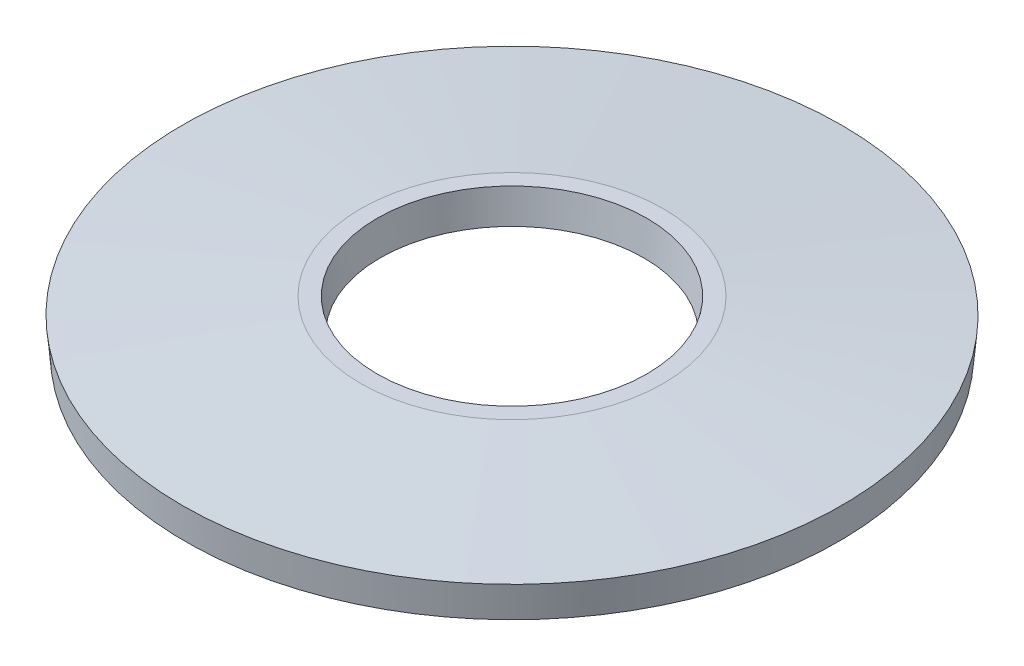
ISO-10303-21;
HEADER;
FILE_DESCRIPTION(('STEP AP214'),'2;1');
FILE_NAME('part.step','',(''),(''),'','','');
FILE_SCHEMA(('AUTOMOTIVE_DESIGN { 1 0 10303 214 1 1 1 1 }'));
ENDSEC;
DATA;
#1=APPLICATION_CONTEXT('core data for automotive mechanical design processes');
#2=APPLICATION_PROTOCOL_DEFINITION('international standard','automotive_design',2000,#1);
#3=PRODUCT_CONTEXT('',#1,'mechanical');
#4=PRODUCT('Part','Part','',(#3));
#5=PRODUCT_RELATED_PRODUCT_CATEGORY('part','',(#4));
#6=PRODUCT_DEFINITION_FORMATION('','',#4);
#7=PRODUCT_DEFINITION_CONTEXT('part definition',#1,'design');
#8=PRODUCT_DEFINITION('design','',#6,#7);
#9=PRODUCT_DEFINITION_SHAPE('','',#8);
#10=(LENGTH_UNIT() NAMED_UNIT(*) SI_UNIT(.MILLI.,.METRE.));
#11=(NAMED_UNIT(*) PLANE_ANGLE_UNIT() SI_UNIT($,.RADIAN.));
#12=(NAMED_UNIT(*) SI_UNIT($,.STERADIAN.) SOLID_ANGLE_UNIT());
#13=UNCERTAINTY_MEASURE_WITH_UNIT(LENGTH_MEASURE(1.E-05),#10,'distance_accuracy_value','');
#14=(GEOMETRIC_REPRESENTATION_CONTEXT(3) GLOBAL_UNCERTAINTY_ASSIGNED_CONTEXT((#13)) GLOBAL_UNIT_ASSIGNED_CONTEXT((#10,
#11,#12)) REPRESENTATION_CONTEXT('',''));
#15=CARTESIAN_POINT('',(0.,0.,0.));
#16=DIRECTION('',(0.,0.,1.));
#17=DIRECTION('',(1.,0.,0.));
#18=AXIS2_PLACEMENT_3D('',#15,#16,#17);
#19=CARTESIAN_POINT('',(-3.96285336374981,0.,0.));
#20=DIRECTION('',(0.,1.,0.));
#21=DIRECTION('',(0.,0.,1.));
#22=AXIS2_PLACEMENT_3D('',#19,#20,#21);
#23=PLANE('',#22);
#24=CARTESIAN_POINT('',(0.,0.,0.));
#25=DIRECTION('',(0.,-1.,0.));
#26=DIRECTION('',(0.,0.,-1.));
#27=AXIS2_PLACEMENT_3D('',#24,#25,#26);
#28=CIRCLE('',#27,3.76285336374981);
#29=CARTESIAN_POINT('',(0.,0.,-3.76285336374981));
#30=VERTEX_POINT('',#29);
#31=EDGE_CURVE('E10',#30,#30,#28,.T.);
#32=ORIENTED_EDGE('',*,*,#31,.F.);
#33=EDGE_LOOP('',(#32));
#34=FACE_BOUND('',#33,.T.);
#35=CARTESIAN_POINT('',(0.,0.,0.));
#36=DIRECTION('',(0.,-1.,0.));
#37=DIRECTION('',(0.,0.,-1.));
#38=AXIS2_PLACEMENT_3D('',#35,#36,#37);
#39=CIRCLE('',#38,3.96285336374981);
#40=CARTESIAN_POINT('',(0.,0.,-3.96285336374981));
#41=VERTEX_POINT('',#40);
#42=EDGE_CURVE('E71',#41,#41,#39,.T.);
#43=ORIENTED_EDGE('',*,*,#42,.T.);
#44=EDGE_LOOP('',(#43));
#45=FACE_BOUND('',#44,.T.);
#46=ADVANCED_FACE('F43',(#34,#45),#23,.F.);
#47=CARTESIAN_POINT('',(0.,0.,0.));
#48=DIRECTION('',(0.,-1.,0.));
#49=DIRECTION('',(0.,0.,-1.));
#50=AXIS2_PLACEMENT_3D('',#47,#48,#49);
#51=CONICAL_SURFACE('',#50,3.76285336374981,1.47779573206142);
#52=CARTESIAN_POINT('',(0.,0.201728575698311,0.));
#53=DIRECTION('',(0.,-1.,0.));
#54=DIRECTION('',(0.,0.,-1.));
#55=AXIS2_PLACEMENT_3D('',#52,#53,#54);
#56=CIRCLE('',#55,1.6);
#57=CARTESIAN_POINT('',(0.,0.201728575698311,-1.6));
#58=VERTEX_POINT('',#57);
#59=EDGE_CURVE('E50',#58,#58,#56,.T.);
#60=ORIENTED_EDGE('',*,*,#59,.F.);
#61=EDGE_LOOP('',(#60));
#62=FACE_BOUND('',#61,.T.);
#63=ORIENTED_EDGE('',*,*,#31,.T.);
#64=EDGE_LOOP('',(#63));
#65=FACE_BOUND('',#64,.T.);
#66=ADVANCED_FACE('F96',(#62,#65),#51,.F.);
#67=CARTESIAN_POINT('',(0.,0.201728575698311,0.));
#68=DIRECTION('',(0.,1.,0.));
#69=DIRECTION('',(0.,0.,1.));
#70=AXIS2_PLACEMENT_3D('',#67,#68,#69);
#71=CONICAL_SURFACE('',#70,1.6,0.0930005947334731);
#72=CARTESIAN_POINT('',(0.,0.6,0.));
#73=DIRECTION('',(0.,-1.,0.));
#74=DIRECTION('',(0.,0.,-1.));
#75=AXIS2_PLACEMENT_3D('',#72,#73,#74);
#76=CIRCLE('',#75,1.63714663625019);
#77=CARTESIAN_POINT('',(0.,0.6,-1.63714663625019));
#78=VERTEX_POINT('',#77);
#79=EDGE_CURVE('E56',#78,#78,#76,.T.);
#80=ORIENTED_EDGE('',*,*,#79,.F.);
#81=EDGE_LOOP('',(#80));
#82=FACE_BOUND('',#81,.T.);
#83=ORIENTED_EDGE('',*,*,#59,.T.);
#84=EDGE_LOOP('',(#83));
#85=FACE_BOUND('',#84,.T.);
#86=ADVANCED_FACE('F91',(#82,#85),#71,.F.);
#87=CARTESIAN_POINT('',(-1.83714663625019,0.6,0.));
#88=DIRECTION('',(0.,-1.,0.));
#89=DIRECTION('',(0.,0.,-1.));
#90=AXIS2_PLACEMENT_3D('',#87,#88,#89);
#91=PLANE('',#90);
#92=CARTESIAN_POINT('',(0.,0.6,0.));
#93=DIRECTION('',(0.,-1.,0.));
#94=DIRECTION('',(0.,0.,-1.));
#95=AXIS2_PLACEMENT_3D('',#92,#93,#94);
#96=CIRCLE('',#95,1.83714663625019);
#97=CARTESIAN_POINT('',(0.,0.6,-1.83714663625019));
#98=VERTEX_POINT('',#97);
#99=EDGE_CURVE('E61',#98,#98,#96,.T.);
#100=ORIENTED_EDGE('',*,*,#99,.F.);
#101=EDGE_LOOP('',(#100));
#102=FACE_BOUND('',#101,.T.);
#103=ORIENTED_EDGE('',*,*,#79,.T.);
#104=EDGE_LOOP('',(#103));
#105=FACE_BOUND('',#104,.T.);
#106=ADVANCED_FACE('F85',(#102,#105),#91,.F.);
#107=CARTESIAN_POINT('',(0.,0.6,0.));
#108=DIRECTION('',(0.,-1.,0.));
#109=DIRECTION('',(0.,0.,-1.));
#110=AXIS2_PLACEMENT_3D('',#107,#108,#109);
#111=CONICAL_SURFACE('',#110,1.83714663625019,1.47779573206142);
#112=CARTESIAN_POINT('',(0.,0.398271424301689,0.));
#113=DIRECTION('',(0.,-1.,0.));
#114=DIRECTION('',(0.,0.,-1.));
#115=AXIS2_PLACEMENT_3D('',#112,#113,#114);
#116=CIRCLE('',#115,4.);
#117=CARTESIAN_POINT('',(0.,0.398271424301689,-4.));
#118=VERTEX_POINT('',#117);
#119=EDGE_CURVE('E67',#118,#118,#116,.T.);
#120=ORIENTED_EDGE('',*,*,#119,.F.);
#121=EDGE_LOOP('',(#120));
#122=FACE_BOUND('',#121,.T.);
#123=ORIENTED_EDGE('',*,*,#99,.T.);
#124=EDGE_LOOP('',(#123));
#125=FACE_BOUND('',#124,.T.);
#126=ADVANCED_FACE('F79',(#122,#125),#111,.T.);
#127=CARTESIAN_POINT('',(0.,0.398271424301689,0.));
#128=DIRECTION('',(0.,1.,0.));
#129=DIRECTION('',(0.,0.,1.));
#130=AXIS2_PLACEMENT_3D('',#127,#128,#129);
#131=CONICAL_SURFACE('',#130,4.,0.0930005947334731);
#132=ORIENTED_EDGE('',*,*,#42,.F.);
#133=EDGE_LOOP('',(#132));
#134=FACE_BOUND('',#133,.T.);
#135=ORIENTED_EDGE('',*,*,#119,.T.);
#136=EDGE_LOOP('',(#135));
#137=FACE_BOUND('',#136,.T.);
#138=ADVANCED_FACE('F76',(#134,#137),#131,.T.);
#139=CLOSED_SHELL('',(#46,#66,#86,#106,#126,#138));
#140=MANIFOLD_SOLID_BREP('B2',#139);
#141=ADVANCED_BREP_SHAPE_REPRESENTATION('',(#18,#140),#14);
#142=SHAPE_DEFINITION_REPRESENTATION(#9,#141);
ENDSEC;
END-ISO-10303-21;
